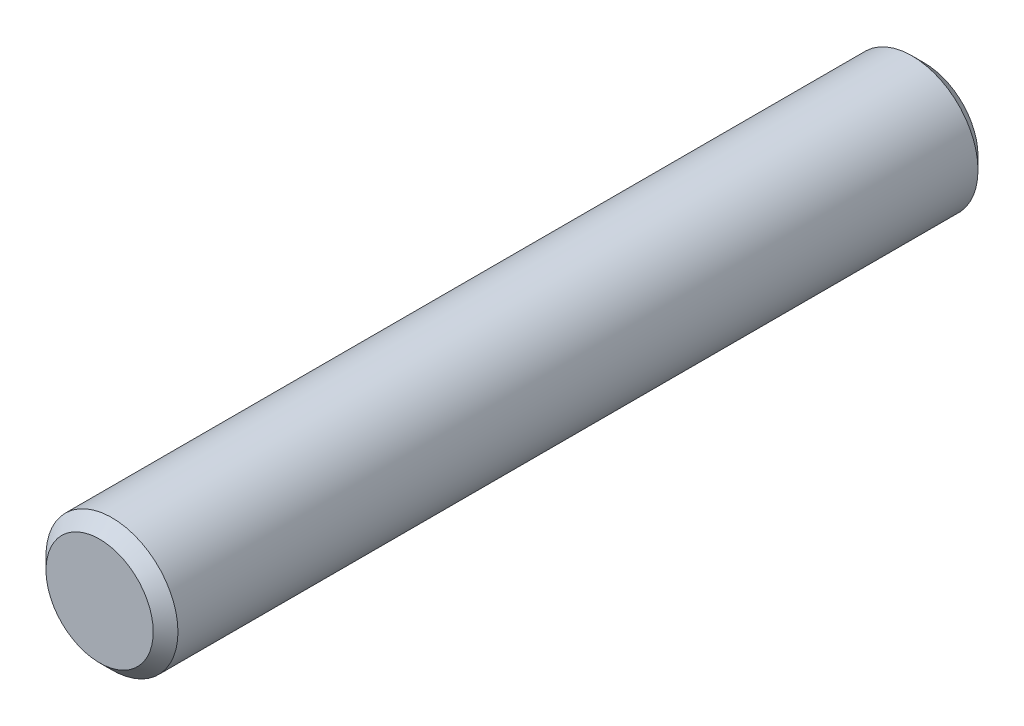
ISO-10303-21;
HEADER;
FILE_DESCRIPTION(('STEP AP214'),'2;1');
FILE_NAME('part.step','',(''),(''),'','','');
FILE_SCHEMA(('AUTOMOTIVE_DESIGN { 1 0 10303 214 1 1 1 1 }'));
ENDSEC;
DATA;
#1=APPLICATION_CONTEXT('core data for automotive mechanical design processes');
#2=APPLICATION_PROTOCOL_DEFINITION('international standard','automotive_design',2000,#1);
#3=PRODUCT_CONTEXT('',#1,'mechanical');
#4=PRODUCT('Part','Part','',(#3));
#5=PRODUCT_RELATED_PRODUCT_CATEGORY('part','',(#4));
#6=PRODUCT_DEFINITION_FORMATION('','',#4);
#7=PRODUCT_DEFINITION_CONTEXT('part definition',#1,'design');
#8=PRODUCT_DEFINITION('design','',#6,#7);
#9=PRODUCT_DEFINITION_SHAPE('','',#8);
#10=(LENGTH_UNIT() NAMED_UNIT(*) SI_UNIT(.MILLI.,.METRE.));
#11=(NAMED_UNIT(*) PLANE_ANGLE_UNIT() SI_UNIT($,.RADIAN.));
#12=(NAMED_UNIT(*) SI_UNIT($,.STERADIAN.) SOLID_ANGLE_UNIT());
#13=UNCERTAINTY_MEASURE_WITH_UNIT(LENGTH_MEASURE(1.E-05),#10,'distance_accuracy_value','');
#14=(GEOMETRIC_REPRESENTATION_CONTEXT(3) GLOBAL_UNCERTAINTY_ASSIGNED_CONTEXT((#13)) GLOBAL_UNIT_ASSIGNED_CONTEXT((#10,
#11,#12)) REPRESENTATION_CONTEXT('',''));
#15=CARTESIAN_POINT('',(0.,0.,0.));
#16=DIRECTION('',(0.,0.,1.));
#17=DIRECTION('',(1.,0.,0.));
#18=AXIS2_PLACEMENT_3D('',#15,#16,#17);
#19=CARTESIAN_POINT('',(0.,0.,50.));
#20=DIRECTION('',(0.,0.,-1.));
#21=DIRECTION('',(-1.,0.,0.));
#22=AXIS2_PLACEMENT_3D('',#19,#20,#21);
#23=CYLINDRICAL_SURFACE('',#22,4.);
#24=CARTESIAN_POINT('',(0.,0.,0.749999999999987));
#25=DIRECTION('',(0.,0.,1.));
#26=DIRECTION('',(1.,0.,0.));
#27=AXIS2_PLACEMENT_3D('',#24,#25,#26);
#28=CIRCLE('',#27,4.);
#29=CARTESIAN_POINT('',(4.,0.,0.749999999999987));
#30=VERTEX_POINT('',#29);
#31=EDGE_CURVE('E42',#30,#30,#28,.T.);
#32=ORIENTED_EDGE('',*,*,#31,.T.);
#33=EDGE_LOOP('',(#32));
#34=FACE_BOUND('',#33,.T.);
#35=CARTESIAN_POINT('',(0.,0.,49.25));
#36=DIRECTION('',(0.,0.,1.));
#37=DIRECTION('',(1.,0.,0.));
#38=AXIS2_PLACEMENT_3D('',#35,#36,#37);
#39=CIRCLE('',#38,4.);
#40=CARTESIAN_POINT('',(4.,0.,49.25));
#41=VERTEX_POINT('',#40);
#42=EDGE_CURVE('E46',#41,#41,#39,.F.);
#43=ORIENTED_EDGE('',*,*,#42,.T.);
#44=EDGE_LOOP('',(#43));
#45=FACE_BOUND('',#44,.T.);
#46=ADVANCED_FACE('F31',(#34,#45),#23,.T.);
#47=CARTESIAN_POINT('',(0.,0.,50.));
#48=DIRECTION('',(0.,0.,1.));
#49=DIRECTION('',(1.,0.,0.));
#50=AXIS2_PLACEMENT_3D('',#47,#48,#49);
#51=PLANE('',#50);
#52=CARTESIAN_POINT('',(0.,0.,50.));
#53=DIRECTION('',(0.,0.,1.));
#54=DIRECTION('',(1.,0.,0.));
#55=AXIS2_PLACEMENT_3D('',#52,#53,#54);
#56=CIRCLE('',#55,3.24999999999999);
#57=CARTESIAN_POINT('',(3.24999999999999,0.,50.));
#58=VERTEX_POINT('',#57);
#59=EDGE_CURVE('E10',#58,#58,#56,.T.);
#60=ORIENTED_EDGE('',*,*,#59,.T.);
#61=EDGE_LOOP('',(#60));
#62=FACE_BOUND('',#61,.T.);
#63=ADVANCED_FACE('F62',(#62),#51,.T.);
#64=CARTESIAN_POINT('',(0.,0.,0.));
#65=DIRECTION('',(0.,0.,1.));
#66=DIRECTION('',(1.,0.,0.));
#67=AXIS2_PLACEMENT_3D('',#64,#65,#66);
#68=PLANE('',#67);
#69=CARTESIAN_POINT('',(0.,0.,0.));
#70=DIRECTION('',(0.,0.,1.));
#71=DIRECTION('',(1.,0.,0.));
#72=AXIS2_PLACEMENT_3D('',#69,#70,#71);
#73=CIRCLE('',#72,3.25);
#74=CARTESIAN_POINT('',(3.25,0.,0.));
#75=VERTEX_POINT('',#74);
#76=EDGE_CURVE('E38',#75,#75,#73,.F.);
#77=ORIENTED_EDGE('',*,*,#76,.T.);
#78=EDGE_LOOP('',(#77));
#79=FACE_BOUND('',#78,.T.);
#80=ADVANCED_FACE('F59',(#79),#68,.F.);
#81=CARTESIAN_POINT('',(0.,0.,0.749999999999987));
#82=DIRECTION('',(0.,0.,1.));
#83=DIRECTION('',(1.,0.,0.));
#84=AXIS2_PLACEMENT_3D('',#81,#82,#83);
#85=CONICAL_SURFACE('',#84,4.,0.785398163397455);
#86=ORIENTED_EDGE('',*,*,#76,.F.);
#87=EDGE_LOOP('',(#86));
#88=FACE_BOUND('',#87,.T.);
#89=ORIENTED_EDGE('',*,*,#31,.F.);
#90=EDGE_LOOP('',(#89));
#91=FACE_BOUND('',#90,.T.);
#92=ADVANCED_FACE('F55',(#88,#91),#85,.T.);
#93=CARTESIAN_POINT('',(0.,0.,50.));
#94=DIRECTION('',(0.,0.,-1.));
#95=DIRECTION('',(-1.,0.,0.));
#96=AXIS2_PLACEMENT_3D('',#93,#94,#95);
#97=CONICAL_SURFACE('',#96,3.24999999999999,0.785398163397446);
#98=ORIENTED_EDGE('',*,*,#42,.F.);
#99=EDGE_LOOP('',(#98));
#100=FACE_BOUND('',#99,.T.);
#101=ORIENTED_EDGE('',*,*,#59,.F.);
#102=EDGE_LOOP('',(#101));
#103=FACE_BOUND('',#102,.T.);
#104=ADVANCED_FACE('F33',(#100,#103),#97,.T.);
#105=CLOSED_SHELL('',(#46,#63,#80,#92,#104));
#106=MANIFOLD_SOLID_BREP('B2',#105);
#107=ADVANCED_BREP_SHAPE_REPRESENTATION('',(#18,#106),#14);
#108=SHAPE_DEFINITION_REPRESENTATION(#9,#107);
ENDSEC;
END-ISO-10303-21;
